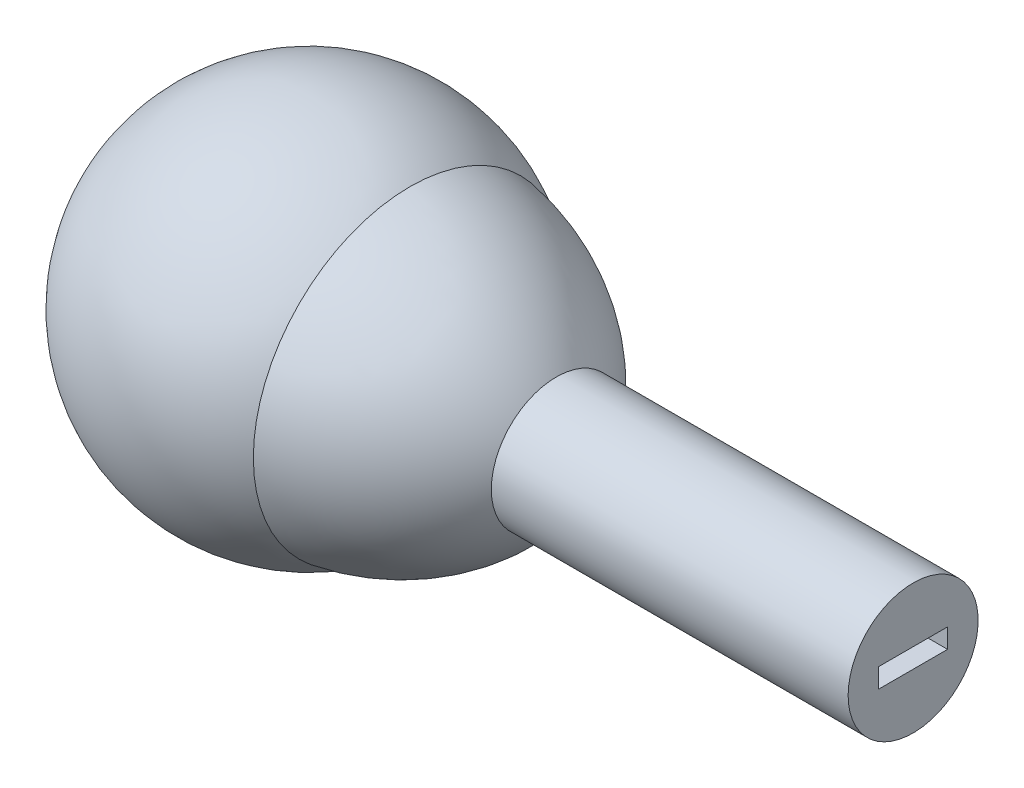
ISO-10303-21;
HEADER;
FILE_DESCRIPTION(('STEP AP214'),'2;1');
FILE_NAME('part.step','',(''),(''),'','','');
FILE_SCHEMA(('AUTOMOTIVE_DESIGN { 1 0 10303 214 1 1 1 1 }'));
ENDSEC;
DATA;
#1=APPLICATION_CONTEXT('core data for automotive mechanical design processes');
#2=APPLICATION_PROTOCOL_DEFINITION('international standard','automotive_design',2000,#1);
#3=PRODUCT_CONTEXT('',#1,'mechanical');
#4=PRODUCT('Part','Part','',(#3));
#5=PRODUCT_RELATED_PRODUCT_CATEGORY('part','',(#4));
#6=PRODUCT_DEFINITION_FORMATION('','',#4);
#7=PRODUCT_DEFINITION_CONTEXT('part definition',#1,'design');
#8=PRODUCT_DEFINITION('design','',#6,#7);
#9=PRODUCT_DEFINITION_SHAPE('','',#8);
#10=(LENGTH_UNIT() NAMED_UNIT(*) SI_UNIT(.MILLI.,.METRE.));
#11=(NAMED_UNIT(*) PLANE_ANGLE_UNIT() SI_UNIT($,.RADIAN.));
#12=(NAMED_UNIT(*) SI_UNIT($,.STERADIAN.) SOLID_ANGLE_UNIT());
#13=UNCERTAINTY_MEASURE_WITH_UNIT(LENGTH_MEASURE(1.E-05),#10,'distance_accuracy_value','');
#14=(GEOMETRIC_REPRESENTATION_CONTEXT(3) GLOBAL_UNCERTAINTY_ASSIGNED_CONTEXT((#13)) GLOBAL_UNIT_ASSIGNED_CONTEXT((#10,
#11,#12)) REPRESENTATION_CONTEXT('',''));
#15=CARTESIAN_POINT('',(0.,0.,0.));
#16=DIRECTION('',(0.,0.,1.));
#17=DIRECTION('',(1.,0.,0.));
#18=AXIS2_PLACEMENT_3D('',#15,#16,#17);
#19=CARTESIAN_POINT('',(-16.5404707637311,0.,0.));
#20=DIRECTION('',(-1.,0.,0.));
#21=DIRECTION('',(0.,0.,1.));
#22=AXIS2_PLACEMENT_3D('',#19,#20,#21);
#23=DEGENERATE_TOROIDAL_SURFACE('',#22,5.,17.2796751441062,.F.);
#24=CARTESIAN_POINT('',(-13.7087755346573,0.,0.));
#25=DIRECTION('',(-1.,0.,0.));
#26=DIRECTION('',(0.,0.,1.));
#27=AXIS2_PLACEMENT_3D('',#24,#25,#26);
#28=CIRCLE('',#27,12.0460750677534);
#29=CARTESIAN_POINT('',(-13.7087755346573,0.,12.0460750677534));
#30=VERTEX_POINT('',#29);
#31=EDGE_CURVE('E11',#30,#30,#28,.T.);
#32=ORIENTED_EDGE('',*,*,#31,.F.);
#33=EDGE_LOOP('',(#32));
#34=FACE_BOUND('',#33,.T.);
#35=CARTESIAN_POINT('',(-2.44837464264808,0.,0.));
#36=DIRECTION('',(-1.,0.,0.));
#37=DIRECTION('',(0.,0.,1.));
#38=AXIS2_PLACEMENT_3D('',#35,#36,#37);
#39=CIRCLE('',#38,5.);
#40=CARTESIAN_POINT('',(-2.44837464264808,0.,5.));
#41=VERTEX_POINT('',#40);
#42=EDGE_CURVE('E125',#41,#41,#39,.T.);
#43=ORIENTED_EDGE('',*,*,#42,.T.);
#44=EDGE_LOOP('',(#43));
#45=FACE_BOUND('',#44,.T.);
#46=ADVANCED_FACE('F39',(#34,#45),#23,.F.);
#47=CARTESIAN_POINT('',(-21.4559676659887,0.,0.));
#48=DIRECTION('',(-1.,0.,0.));
#49=DIRECTION('',(0.,1.,0.));
#50=AXIS2_PLACEMENT_3D('',#47,#48,#49);
#51=SPHERICAL_SURFACE('',#50,14.3222522829935);
#52=ORIENTED_EDGE('',*,*,#31,.T.);
#53=EDGE_LOOP('',(#52));
#54=FACE_BOUND('',#53,.T.);
#55=ADVANCED_FACE('F140',(#54),#51,.T.);
#56=CARTESIAN_POINT('',(25.,5.,0.));
#57=DIRECTION('',(-1.,0.,0.));
#58=DIRECTION('',(0.,0.,1.));
#59=AXIS2_PLACEMENT_3D('',#56,#57,#58);
#60=PLANE('',#59);
#61=DIRECTION('',(0.,0.,1.));
#62=VECTOR('',#61,1.);
#63=CARTESIAN_POINT('',(25.,0.75,2.65));
#64=LINE('',#63,#62);
#65=CARTESIAN_POINT('',(25.,0.75,-2.65));
#66=VERTEX_POINT('',#65);
#67=CARTESIAN_POINT('',(25.,0.75,2.65));
#68=VERTEX_POINT('',#67);
#69=EDGE_CURVE('E89',#66,#68,#64,.T.);
#70=ORIENTED_EDGE('',*,*,#69,.F.);
#71=DIRECTION('',(0.,1.,0.));
#72=VECTOR('',#71,1.);
#73=CARTESIAN_POINT('',(25.,-0.75,-2.65));
#74=LINE('',#73,#72);
#75=CARTESIAN_POINT('',(25.,-0.75,-2.65));
#76=VERTEX_POINT('',#75);
#77=EDGE_CURVE('E54',#76,#66,#74,.T.);
#78=ORIENTED_EDGE('',*,*,#77,.F.);
#79=DIRECTION('',(0.,0.,-1.));
#80=VECTOR('',#79,1.);
#81=CARTESIAN_POINT('',(25.,-0.75,2.65));
#82=LINE('',#81,#80);
#83=CARTESIAN_POINT('',(25.,-0.75,2.65));
#84=VERTEX_POINT('',#83);
#85=EDGE_CURVE('E109',#84,#76,#82,.T.);
#86=ORIENTED_EDGE('',*,*,#85,.F.);
#87=DIRECTION('',(0.,-1.,0.));
#88=VECTOR('',#87,1.);
#89=CARTESIAN_POINT('',(25.,-0.75,2.65));
#90=LINE('',#89,#88);
#91=EDGE_CURVE('E118',#68,#84,#90,.T.);
#92=ORIENTED_EDGE('',*,*,#91,.F.);
#93=EDGE_LOOP('',(#70,#78,#86,#92));
#94=FACE_BOUND('',#93,.T.);
#95=CARTESIAN_POINT('',(25.,0.,0.));
#96=DIRECTION('',(-1.,0.,0.));
#97=DIRECTION('',(0.,0.,1.));
#98=AXIS2_PLACEMENT_3D('',#95,#96,#97);
#99=CIRCLE('',#98,5.);
#100=CARTESIAN_POINT('',(25.,0.,5.));
#101=VERTEX_POINT('',#100);
#102=EDGE_CURVE('E47',#101,#101,#99,.T.);
#103=ORIENTED_EDGE('',*,*,#102,.F.);
#104=EDGE_LOOP('',(#103));
#105=FACE_BOUND('',#104,.T.);
#106=ADVANCED_FACE('F138',(#94,#105),#60,.F.);
#107=CARTESIAN_POINT('',(-28.1875623505866,0.,0.));
#108=DIRECTION('',(-1.,0.,0.));
#109=DIRECTION('',(0.,0.,1.));
#110=AXIS2_PLACEMENT_3D('',#107,#108,#109);
#111=CYLINDRICAL_SURFACE('',#110,5.);
#112=ORIENTED_EDGE('',*,*,#42,.F.);
#113=EDGE_LOOP('',(#112));
#114=FACE_BOUND('',#113,.T.);
#115=ORIENTED_EDGE('',*,*,#102,.T.);
#116=EDGE_LOOP('',(#115));
#117=FACE_BOUND('',#116,.T.);
#118=ADVANCED_FACE('F136',(#114,#117),#111,.T.);
#119=CARTESIAN_POINT('',(13.,-0.75,-2.65));
#120=DIRECTION('',(0.,0.,-1.));
#121=DIRECTION('',(-1.,0.,0.));
#122=AXIS2_PLACEMENT_3D('',#119,#120,#121);
#123=PLANE('',#122);
#124=ORIENTED_EDGE('',*,*,#77,.T.);
#125=DIRECTION('',(1.,0.,0.));
#126=VECTOR('',#125,1.);
#127=CARTESIAN_POINT('',(13.,0.75,-2.65));
#128=LINE('',#127,#126);
#129=CARTESIAN_POINT('',(13.,0.75,-2.65));
#130=VERTEX_POINT('',#129);
#131=EDGE_CURVE('E77',#130,#66,#128,.T.);
#132=ORIENTED_EDGE('',*,*,#131,.F.);
#133=DIRECTION('',(0.,1.,0.));
#134=VECTOR('',#133,1.);
#135=CARTESIAN_POINT('',(13.,-0.75,-2.65));
#136=LINE('',#135,#134);
#137=CARTESIAN_POINT('',(13.,-0.75,-2.65));
#138=VERTEX_POINT('',#137);
#139=EDGE_CURVE('E105',#138,#130,#136,.T.);
#140=ORIENTED_EDGE('',*,*,#139,.F.);
#141=DIRECTION('',(1.,0.,0.));
#142=VECTOR('',#141,1.);
#143=CARTESIAN_POINT('',(13.,-0.75,-2.65));
#144=LINE('',#143,#142);
#145=EDGE_CURVE('E62',#138,#76,#144,.T.);
#146=ORIENTED_EDGE('',*,*,#145,.T.);
#147=EDGE_LOOP('',(#124,#132,#140,#146));
#148=FACE_BOUND('',#147,.T.);
#149=ADVANCED_FACE('F147',(#148),#123,.F.);
#150=CARTESIAN_POINT('',(13.,-0.75,2.65));
#151=DIRECTION('',(0.,-1.,0.));
#152=DIRECTION('',(0.,0.,-1.));
#153=AXIS2_PLACEMENT_3D('',#150,#151,#152);
#154=PLANE('',#153);
#155=ORIENTED_EDGE('',*,*,#85,.T.);
#156=ORIENTED_EDGE('',*,*,#145,.F.);
#157=DIRECTION('',(0.,0.,-1.));
#158=VECTOR('',#157,1.);
#159=CARTESIAN_POINT('',(13.,-0.75,2.65));
#160=LINE('',#159,#158);
#161=CARTESIAN_POINT('',(13.,-0.75,2.65));
#162=VERTEX_POINT('',#161);
#163=EDGE_CURVE('E102',#162,#138,#160,.T.);
#164=ORIENTED_EDGE('',*,*,#163,.F.);
#165=DIRECTION('',(1.,0.,0.));
#166=VECTOR('',#165,1.);
#167=CARTESIAN_POINT('',(13.,-0.75,2.65));
#168=LINE('',#167,#166);
#169=EDGE_CURVE('E94',#162,#84,#168,.T.);
#170=ORIENTED_EDGE('',*,*,#169,.T.);
#171=EDGE_LOOP('',(#155,#156,#164,#170));
#172=FACE_BOUND('',#171,.T.);
#173=ADVANCED_FACE('F181',(#172),#154,.F.);
#174=CARTESIAN_POINT('',(13.,-0.75,2.65));
#175=DIRECTION('',(0.,0.,1.));
#176=DIRECTION('',(1.,0.,0.));
#177=AXIS2_PLACEMENT_3D('',#174,#175,#176);
#178=PLANE('',#177);
#179=ORIENTED_EDGE('',*,*,#91,.T.);
#180=ORIENTED_EDGE('',*,*,#169,.F.);
#181=DIRECTION('',(0.,-1.,0.));
#182=VECTOR('',#181,1.);
#183=CARTESIAN_POINT('',(13.,-0.75,2.65));
#184=LINE('',#183,#182);
#185=CARTESIAN_POINT('',(13.,0.75,2.65));
#186=VERTEX_POINT('',#185);
#187=EDGE_CURVE('E97',#186,#162,#184,.T.);
#188=ORIENTED_EDGE('',*,*,#187,.F.);
#189=DIRECTION('',(1.,0.,0.));
#190=VECTOR('',#189,1.);
#191=CARTESIAN_POINT('',(13.,0.75,2.65));
#192=LINE('',#191,#190);
#193=EDGE_CURVE('E82',#186,#68,#192,.T.);
#194=ORIENTED_EDGE('',*,*,#193,.T.);
#195=EDGE_LOOP('',(#179,#180,#188,#194));
#196=FACE_BOUND('',#195,.T.);
#197=ADVANCED_FACE('F98',(#196),#178,.F.);
#198=CARTESIAN_POINT('',(13.,0.75,2.65));
#199=DIRECTION('',(0.,1.,0.));
#200=DIRECTION('',(0.,0.,1.));
#201=AXIS2_PLACEMENT_3D('',#198,#199,#200);
#202=PLANE('',#201);
#203=ORIENTED_EDGE('',*,*,#69,.T.);
#204=ORIENTED_EDGE('',*,*,#193,.F.);
#205=DIRECTION('',(0.,0.,1.));
#206=VECTOR('',#205,1.);
#207=CARTESIAN_POINT('',(13.,0.75,2.65));
#208=LINE('',#207,#206);
#209=EDGE_CURVE('E86',#130,#186,#208,.T.);
#210=ORIENTED_EDGE('',*,*,#209,.F.);
#211=ORIENTED_EDGE('',*,*,#131,.T.);
#212=EDGE_LOOP('',(#203,#204,#210,#211));
#213=FACE_BOUND('',#212,.T.);
#214=ADVANCED_FACE('F84',(#213),#202,.F.);
#215=CARTESIAN_POINT('',(13.,0.,0.));
#216=DIRECTION('',(-1.,0.,0.));
#217=DIRECTION('',(0.,0.,1.));
#218=AXIS2_PLACEMENT_3D('',#215,#216,#217);
#219=PLANE('',#218);
#220=ORIENTED_EDGE('',*,*,#139,.T.);
#221=ORIENTED_EDGE('',*,*,#209,.T.);
#222=ORIENTED_EDGE('',*,*,#187,.T.);
#223=ORIENTED_EDGE('',*,*,#163,.T.);
#224=EDGE_LOOP('',(#220,#221,#222,#223));
#225=FACE_BOUND('',#224,.T.);
#226=ADVANCED_FACE('F104',(#225),#219,.F.);
#227=CLOSED_SHELL('',(#46,#55,#106,#118,#149,#173,#197,#214,#226));
#228=MANIFOLD_SOLID_BREP('B2',#227);
#229=ADVANCED_BREP_SHAPE_REPRESENTATION('',(#18,#228),#14);
#230=SHAPE_DEFINITION_REPRESENTATION(#9,#229);
ENDSEC;
END-ISO-10303-21;
